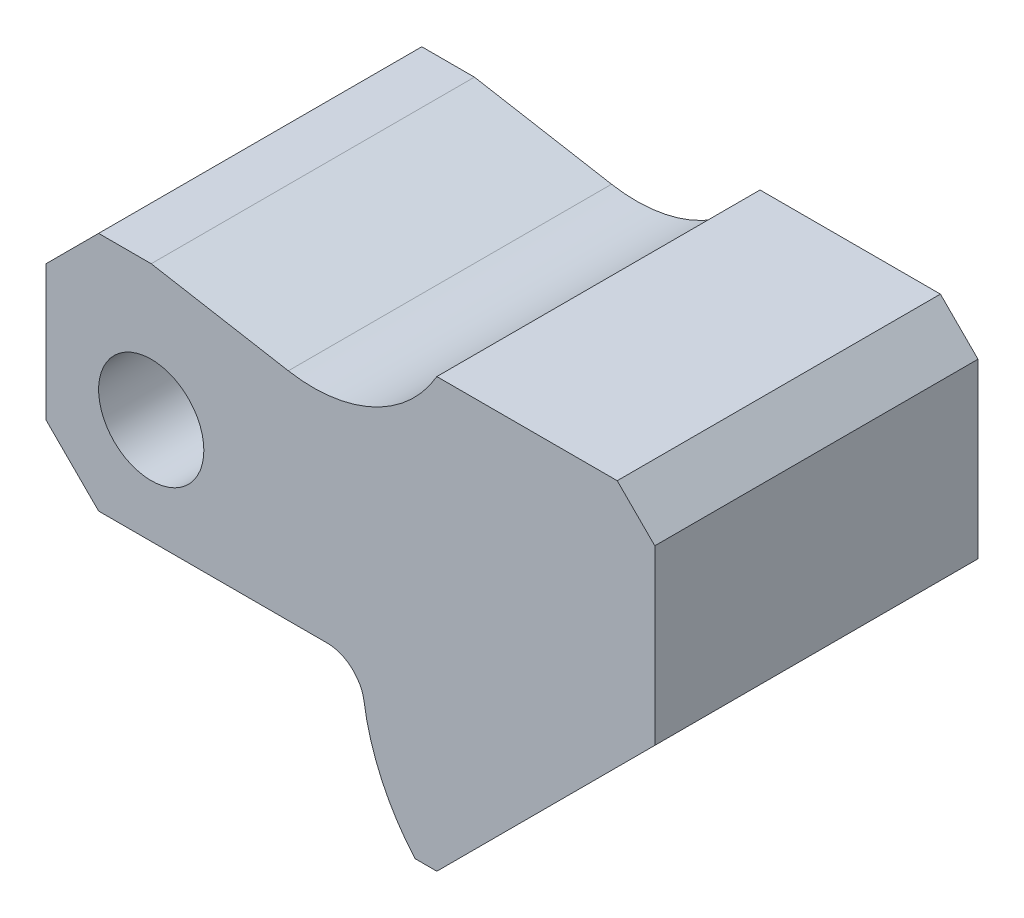
ISO-10303-21;
HEADER;
FILE_DESCRIPTION(('STEP AP214'),'2;1');
FILE_NAME('part.step','',(''),(''),'','','');
FILE_SCHEMA(('AUTOMOTIVE_DESIGN { 1 0 10303 214 1 1 1 1 }'));
ENDSEC;
DATA;
#1=APPLICATION_CONTEXT('core data for automotive mechanical design processes');
#2=APPLICATION_PROTOCOL_DEFINITION('international standard','automotive_design',2000,#1);
#3=PRODUCT_CONTEXT('',#1,'mechanical');
#4=PRODUCT('Part','Part','',(#3));
#5=PRODUCT_RELATED_PRODUCT_CATEGORY('part','',(#4));
#6=PRODUCT_DEFINITION_FORMATION('','',#4);
#7=PRODUCT_DEFINITION_CONTEXT('part definition',#1,'design');
#8=PRODUCT_DEFINITION('design','',#6,#7);
#9=PRODUCT_DEFINITION_SHAPE('','',#8);
#10=(LENGTH_UNIT() NAMED_UNIT(*) SI_UNIT(.MILLI.,.METRE.));
#11=(NAMED_UNIT(*) PLANE_ANGLE_UNIT() SI_UNIT($,.RADIAN.));
#12=(NAMED_UNIT(*) SI_UNIT($,.STERADIAN.) SOLID_ANGLE_UNIT());
#13=UNCERTAINTY_MEASURE_WITH_UNIT(LENGTH_MEASURE(1.E-05),#10,'distance_accuracy_value','');
#14=(GEOMETRIC_REPRESENTATION_CONTEXT(3) GLOBAL_UNCERTAINTY_ASSIGNED_CONTEXT((#13)) GLOBAL_UNIT_ASSIGNED_CONTEXT((#10,
#11,#12)) REPRESENTATION_CONTEXT('',''));
#15=CARTESIAN_POINT('',(0.,0.,0.));
#16=DIRECTION('',(0.,0.,1.));
#17=DIRECTION('',(1.,0.,0.));
#18=AXIS2_PLACEMENT_3D('',#15,#16,#17);
#19=CARTESIAN_POINT('',(37.3696565583993,-30.,43.));
#20=DIRECTION('',(0.,0.,-1.));
#21=DIRECTION('',(-1.,0.,0.));
#22=AXIS2_PLACEMENT_3D('',#19,#20,#21);
#23=PLANE('',#22);
#24=DIRECTION('',(0.,-1.,0.));
#25=VECTOR('',#24,1.);
#26=CARTESIAN_POINT('',(0.,0.,43.));
#27=LINE('',#26,#25);
#28=CARTESIAN_POINT('',(0.,0.,43.));
#29=VERTEX_POINT('',#28);
#30=CARTESIAN_POINT('',(0.,-18.,43.));
#31=VERTEX_POINT('',#30);
#32=EDGE_CURVE('E198',#29,#31,#27,.T.);
#33=ORIENTED_EDGE('',*,*,#32,.T.);
#34=DIRECTION('',(0.707106781186549,-0.707106781186546,0.));
#35=VECTOR('',#34,1.);
#36=CARTESIAN_POINT('',(0.,-18.,43.));
#37=LINE('',#36,#35);
#38=CARTESIAN_POINT('',(7.00000000000003,-25.,43.));
#39=VERTEX_POINT('',#38);
#40=EDGE_CURVE('E116',#31,#39,#37,.T.);
#41=ORIENTED_EDGE('',*,*,#40,.T.);
#42=DIRECTION('',(1.,0.,0.));
#43=VECTOR('',#42,1.);
#44=CARTESIAN_POINT('',(7.00000000000003,-25.,43.));
#45=LINE('',#44,#43);
#46=CARTESIAN_POINT('',(37.3696565583993,-25.,43.));
#47=VERTEX_POINT('',#46);
#48=EDGE_CURVE('E231',#39,#47,#45,.T.);
#49=ORIENTED_EDGE('',*,*,#48,.T.);
#50=CARTESIAN_POINT('',(37.3696565583993,-30.,43.));
#51=DIRECTION('',(0.,0.,-1.));
#52=DIRECTION('',(-1.,0.,0.));
#53=AXIS2_PLACEMENT_3D('',#50,#51,#52);
#54=CIRCLE('',#53,5.);
#55=CARTESIAN_POINT('',(42.3152952998111,-29.2647058823529,43.));
#56=VERTEX_POINT('',#55);
#57=EDGE_CURVE('E250',#47,#56,#54,.T.);
#58=ORIENTED_EDGE('',*,*,#57,.T.);
#59=CARTESIAN_POINT('',(70.9999999999997,-25.,43.));
#60=DIRECTION('',(0.,0.,1.));
#61=DIRECTION('',(1.,0.,0.));
#62=AXIS2_PLACEMENT_3D('',#59,#60,#61);
#63=CIRCLE('',#62,29.);
#64=CARTESIAN_POINT('',(49.0910976997931,-44.,43.));
#65=VERTEX_POINT('',#64);
#66=EDGE_CURVE('E247',#56,#65,#63,.T.);
#67=ORIENTED_EDGE('',*,*,#66,.T.);
#68=DIRECTION('',(1.,0.,0.));
#69=VECTOR('',#68,1.);
#70=CARTESIAN_POINT('',(52.,-44.,43.));
#71=LINE('',#70,#69);
#72=CARTESIAN_POINT('',(52.,-44.,43.));
#73=VERTEX_POINT('',#72);
#74=EDGE_CURVE('E249',#65,#73,#71,.T.);
#75=ORIENTED_EDGE('',*,*,#74,.T.);
#76=DIRECTION('',(0.707106781186542,0.707106781186552,0.));
#77=VECTOR('',#76,1.);
#78=CARTESIAN_POINT('',(81.,-14.9999999999996,43.));
#79=LINE('',#78,#77);
#80=CARTESIAN_POINT('',(81.,-14.9999999999996,43.));
#81=VERTEX_POINT('',#80);
#82=EDGE_CURVE('E252',#73,#81,#79,.T.);
#83=ORIENTED_EDGE('',*,*,#82,.T.);
#84=DIRECTION('',(0.,1.,0.));
#85=VECTOR('',#84,1.);
#86=CARTESIAN_POINT('',(81.,8.,43.));
#87=LINE('',#86,#85);
#88=CARTESIAN_POINT('',(81.,8.,43.));
#89=VERTEX_POINT('',#88);
#90=EDGE_CURVE('E258',#81,#89,#87,.T.);
#91=ORIENTED_EDGE('',*,*,#90,.T.);
#92=DIRECTION('',(-0.707106781186553,0.707106781186542,0.));
#93=VECTOR('',#92,1.);
#94=CARTESIAN_POINT('',(75.9999999999999,13.,43.));
#95=LINE('',#94,#93);
#96=CARTESIAN_POINT('',(75.9999999999999,13.,43.));
#97=VERTEX_POINT('',#96);
#98=EDGE_CURVE('E260',#89,#97,#95,.T.);
#99=ORIENTED_EDGE('',*,*,#98,.T.);
#100=DIRECTION('',(-1.,0.,0.));
#101=VECTOR('',#100,1.);
#102=CARTESIAN_POINT('',(52.,13.,43.));
#103=LINE('',#102,#101);
#104=CARTESIAN_POINT('',(52.,13.,43.));
#105=VERTEX_POINT('',#104);
#106=EDGE_CURVE('E262',#97,#105,#103,.T.);
#107=ORIENTED_EDGE('',*,*,#106,.T.);
#108=CARTESIAN_POINT('',(35.5424003635473,22.4945992125119,43.));
#109=DIRECTION('',(0.,0.,-1.));
#110=DIRECTION('',(1.,0.,0.));
#111=AXIS2_PLACEMENT_3D('',#108,#109,#110);
#112=CIRCLE('',#111,19.);
#113=CARTESIAN_POINT('',(32.2430849878756,3.78325190527996,43.));
#114=VERTEX_POINT('',#113);
#115=EDGE_CURVE('E153',#105,#114,#112,.T.);
#116=ORIENTED_EDGE('',*,*,#115,.T.);
#117=DIRECTION('',(-0.984807753012208,0.173648177666931,0.));
#118=VECTOR('',#117,1.);
#119=CARTESIAN_POINT('',(14.,7.,43.));
#120=LINE('',#119,#118);
#121=CARTESIAN_POINT('',(14.,7.,43.));
#122=VERTEX_POINT('',#121);
#123=EDGE_CURVE('E147',#114,#122,#120,.T.);
#124=ORIENTED_EDGE('',*,*,#123,.T.);
#125=DIRECTION('',(-1.,0.,0.));
#126=VECTOR('',#125,1.);
#127=CARTESIAN_POINT('',(6.9999999999999,7.,43.));
#128=LINE('',#127,#126);
#129=CARTESIAN_POINT('',(6.9999999999999,7.,43.));
#130=VERTEX_POINT('',#129);
#131=EDGE_CURVE('E151',#122,#130,#128,.T.);
#132=ORIENTED_EDGE('',*,*,#131,.T.);
#133=DIRECTION('',(-0.707106781186542,-0.707106781186552,0.));
#134=VECTOR('',#133,1.);
#135=CARTESIAN_POINT('',(0.,0.,43.));
#136=LINE('',#135,#134);
#137=EDGE_CURVE('E55',#130,#29,#136,.T.);
#138=ORIENTED_EDGE('',*,*,#137,.T.);
#139=EDGE_LOOP('',(#33,#41,#49,#58,#67,#75,#83,#91,#99,#107,#116,#124,#132,#138));
#140=FACE_BOUND('',#139,.T.);
#141=CARTESIAN_POINT('',(14.,-11.,43.));
#142=DIRECTION('',(0.,0.,1.));
#143=DIRECTION('',(1.,0.,0.));
#144=AXIS2_PLACEMENT_3D('',#141,#142,#143);
#145=CIRCLE('',#144,7.);
#146=CARTESIAN_POINT('',(21.,-11.,43.));
#147=VERTEX_POINT('',#146);
#148=EDGE_CURVE('E175',#147,#147,#145,.T.);
#149=ORIENTED_EDGE('',*,*,#148,.F.);
#150=EDGE_LOOP('',(#149));
#151=FACE_BOUND('',#150,.T.);
#152=ADVANCED_FACE('F38',(#140,#151),#23,.F.);
#153=CARTESIAN_POINT('',(37.3696565583993,-30.,0.));
#154=DIRECTION('',(0.,0.,-1.));
#155=DIRECTION('',(-1.,0.,0.));
#156=AXIS2_PLACEMENT_3D('',#153,#154,#155);
#157=PLANE('',#156);
#158=DIRECTION('',(0.,-1.,0.));
#159=VECTOR('',#158,1.);
#160=CARTESIAN_POINT('',(0.,0.,0.));
#161=LINE('',#160,#159);
#162=CARTESIAN_POINT('',(0.,0.,0.));
#163=VERTEX_POINT('',#162);
#164=CARTESIAN_POINT('',(0.,-18.,0.));
#165=VERTEX_POINT('',#164);
#166=EDGE_CURVE('E171',#163,#165,#161,.T.);
#167=ORIENTED_EDGE('',*,*,#166,.F.);
#168=DIRECTION('',(-0.707106781186542,-0.707106781186552,0.));
#169=VECTOR('',#168,1.);
#170=CARTESIAN_POINT('',(0.,0.,0.));
#171=LINE('',#170,#169);
#172=CARTESIAN_POINT('',(6.9999999999999,7.,0.));
#173=VERTEX_POINT('',#172);
#174=EDGE_CURVE('E108',#173,#163,#171,.T.);
#175=ORIENTED_EDGE('',*,*,#174,.F.);
#176=DIRECTION('',(-1.,0.,0.));
#177=VECTOR('',#176,1.);
#178=CARTESIAN_POINT('',(6.9999999999999,7.,0.));
#179=LINE('',#178,#177);
#180=CARTESIAN_POINT('',(14.,7.,0.));
#181=VERTEX_POINT('',#180);
#182=EDGE_CURVE('E102',#181,#173,#179,.T.);
#183=ORIENTED_EDGE('',*,*,#182,.F.);
#184=DIRECTION('',(-0.984807753012208,0.173648177666931,0.));
#185=VECTOR('',#184,1.);
#186=CARTESIAN_POINT('',(14.,7.,0.));
#187=LINE('',#186,#185);
#188=CARTESIAN_POINT('',(32.2430849878756,3.78325190527996,0.));
#189=VERTEX_POINT('',#188);
#190=EDGE_CURVE('E161',#189,#181,#187,.T.);
#191=ORIENTED_EDGE('',*,*,#190,.F.);
#192=CARTESIAN_POINT('',(35.5424003635473,22.4945992125119,0.));
#193=DIRECTION('',(0.,0.,-1.));
#194=DIRECTION('',(1.,0.,0.));
#195=AXIS2_PLACEMENT_3D('',#192,#193,#194);
#196=CIRCLE('',#195,19.);
#197=CARTESIAN_POINT('',(52.,13.,0.));
#198=VERTEX_POINT('',#197);
#199=EDGE_CURVE('E193',#198,#189,#196,.T.);
#200=ORIENTED_EDGE('',*,*,#199,.F.);
#201=DIRECTION('',(-1.,0.,0.));
#202=VECTOR('',#201,1.);
#203=CARTESIAN_POINT('',(52.,13.,0.));
#204=LINE('',#203,#202);
#205=CARTESIAN_POINT('',(75.9999999999999,13.,0.));
#206=VERTEX_POINT('',#205);
#207=EDGE_CURVE('E191',#206,#198,#204,.T.);
#208=ORIENTED_EDGE('',*,*,#207,.F.);
#209=DIRECTION('',(-0.707106781186553,0.707106781186542,0.));
#210=VECTOR('',#209,1.);
#211=CARTESIAN_POINT('',(75.9999999999999,13.,0.));
#212=LINE('',#211,#210);
#213=CARTESIAN_POINT('',(81.,8.,0.));
#214=VERTEX_POINT('',#213);
#215=EDGE_CURVE('E189',#214,#206,#212,.T.);
#216=ORIENTED_EDGE('',*,*,#215,.F.);
#217=DIRECTION('',(0.,1.,0.));
#218=VECTOR('',#217,1.);
#219=CARTESIAN_POINT('',(81.,8.,0.));
#220=LINE('',#219,#218);
#221=CARTESIAN_POINT('',(81.,-14.9999999999996,0.));
#222=VERTEX_POINT('',#221);
#223=EDGE_CURVE('E187',#222,#214,#220,.T.);
#224=ORIENTED_EDGE('',*,*,#223,.F.);
#225=DIRECTION('',(0.707106781186542,0.707106781186552,0.));
#226=VECTOR('',#225,1.);
#227=CARTESIAN_POINT('',(81.,-14.9999999999996,0.));
#228=LINE('',#227,#226);
#229=CARTESIAN_POINT('',(52.,-44.,0.));
#230=VERTEX_POINT('',#229);
#231=EDGE_CURVE('E185',#230,#222,#228,.T.);
#232=ORIENTED_EDGE('',*,*,#231,.F.);
#233=DIRECTION('',(1.,0.,0.));
#234=VECTOR('',#233,1.);
#235=CARTESIAN_POINT('',(52.,-44.,0.));
#236=LINE('',#235,#234);
#237=CARTESIAN_POINT('',(49.0910976997931,-44.,0.));
#238=VERTEX_POINT('',#237);
#239=EDGE_CURVE('E183',#238,#230,#236,.T.);
#240=ORIENTED_EDGE('',*,*,#239,.F.);
#241=CARTESIAN_POINT('',(70.9999999999997,-25.,0.));
#242=DIRECTION('',(0.,0.,1.));
#243=DIRECTION('',(1.,0.,0.));
#244=AXIS2_PLACEMENT_3D('',#241,#242,#243);
#245=CIRCLE('',#244,29.);
#246=CARTESIAN_POINT('',(42.3152952998111,-29.2647058823529,0.));
#247=VERTEX_POINT('',#246);
#248=EDGE_CURVE('E181',#247,#238,#245,.T.);
#249=ORIENTED_EDGE('',*,*,#248,.F.);
#250=CARTESIAN_POINT('',(37.3696565583993,-30.,0.));
#251=DIRECTION('',(0.,0.,-1.));
#252=DIRECTION('',(-1.,0.,0.));
#253=AXIS2_PLACEMENT_3D('',#250,#251,#252);
#254=CIRCLE('',#253,5.);
#255=CARTESIAN_POINT('',(37.3696565583993,-25.,0.));
#256=VERTEX_POINT('',#255);
#257=EDGE_CURVE('E179',#256,#247,#254,.T.);
#258=ORIENTED_EDGE('',*,*,#257,.F.);
#259=DIRECTION('',(1.,0.,0.));
#260=VECTOR('',#259,1.);
#261=CARTESIAN_POINT('',(7.00000000000003,-25.,0.));
#262=LINE('',#261,#260);
#263=CARTESIAN_POINT('',(7.00000000000003,-25.,0.));
#264=VERTEX_POINT('',#263);
#265=EDGE_CURVE('E177',#264,#256,#262,.T.);
#266=ORIENTED_EDGE('',*,*,#265,.F.);
#267=DIRECTION('',(0.707106781186549,-0.707106781186546,0.));
#268=VECTOR('',#267,1.);
#269=CARTESIAN_POINT('',(0.,-18.,0.));
#270=LINE('',#269,#268);
#271=EDGE_CURVE('E174',#165,#264,#270,.T.);
#272=ORIENTED_EDGE('',*,*,#271,.F.);
#273=EDGE_LOOP('',(#167,#175,#183,#191,#200,#208,#216,#224,#232,#240,#249,#258,#266,#272));
#274=FACE_BOUND('',#273,.T.);
#275=CARTESIAN_POINT('',(14.,-11.,0.));
#276=DIRECTION('',(0.,0.,1.));
#277=DIRECTION('',(1.,0.,0.));
#278=AXIS2_PLACEMENT_3D('',#275,#276,#277);
#279=CIRCLE('',#278,7.);
#280=CARTESIAN_POINT('',(21.,-11.,0.));
#281=VERTEX_POINT('',#280);
#282=EDGE_CURVE('E503',#281,#281,#279,.T.);
#283=ORIENTED_EDGE('',*,*,#282,.T.);
#284=EDGE_LOOP('',(#283));
#285=FACE_BOUND('',#284,.T.);
#286=ADVANCED_FACE('F235',(#274,#285),#157,.T.);
#287=CARTESIAN_POINT('',(0.,0.,43.));
#288=DIRECTION('',(1.,0.,0.));
#289=DIRECTION('',(0.,1.,0.));
#290=AXIS2_PLACEMENT_3D('',#287,#288,#289);
#291=PLANE('',#290);
#292=ORIENTED_EDGE('',*,*,#166,.T.);
#293=DIRECTION('',(0.,0.,-1.));
#294=VECTOR('',#293,1.);
#295=CARTESIAN_POINT('',(0.,-18.,43.));
#296=LINE('',#295,#294);
#297=EDGE_CURVE('E11',#31,#165,#296,.T.);
#298=ORIENTED_EDGE('',*,*,#297,.F.);
#299=ORIENTED_EDGE('',*,*,#32,.F.);
#300=DIRECTION('',(0.,0.,-1.));
#301=VECTOR('',#300,1.);
#302=CARTESIAN_POINT('',(0.,0.,43.));
#303=LINE('',#302,#301);
#304=EDGE_CURVE('E167',#29,#163,#303,.T.);
#305=ORIENTED_EDGE('',*,*,#304,.T.);
#306=EDGE_LOOP('',(#292,#298,#299,#305));
#307=FACE_BOUND('',#306,.T.);
#308=ADVANCED_FACE('F40',(#307),#291,.F.);
#309=CARTESIAN_POINT('',(0.,-18.,43.));
#310=DIRECTION('',(0.707106781186546,0.707106781186549,0.));
#311=DIRECTION('',(-0.707106781186549,0.707106781186546,0.));
#312=AXIS2_PLACEMENT_3D('',#309,#310,#311);
#313=PLANE('',#312);
#314=ORIENTED_EDGE('',*,*,#271,.T.);
#315=DIRECTION('',(0.,0.,-1.));
#316=VECTOR('',#315,1.);
#317=CARTESIAN_POINT('',(7.00000000000003,-25.,43.));
#318=LINE('',#317,#316);
#319=EDGE_CURVE('E47',#39,#264,#318,.T.);
#320=ORIENTED_EDGE('',*,*,#319,.F.);
#321=ORIENTED_EDGE('',*,*,#40,.F.);
#322=ORIENTED_EDGE('',*,*,#297,.T.);
#323=EDGE_LOOP('',(#314,#320,#321,#322));
#324=FACE_BOUND('',#323,.T.);
#325=ADVANCED_FACE('F296',(#324),#313,.F.);
#326=CARTESIAN_POINT('',(7.00000000000003,-25.,43.));
#327=DIRECTION('',(0.,1.,0.));
#328=DIRECTION('',(0.,0.,1.));
#329=AXIS2_PLACEMENT_3D('',#326,#327,#328);
#330=PLANE('',#329);
#331=ORIENTED_EDGE('',*,*,#265,.T.);
#332=DIRECTION('',(0.,0.,-1.));
#333=VECTOR('',#332,1.);
#334=CARTESIAN_POINT('',(37.3696565583993,-25.,43.));
#335=LINE('',#334,#333);
#336=EDGE_CURVE('E223',#47,#256,#335,.T.);
#337=ORIENTED_EDGE('',*,*,#336,.F.);
#338=ORIENTED_EDGE('',*,*,#48,.F.);
#339=ORIENTED_EDGE('',*,*,#319,.T.);
#340=EDGE_LOOP('',(#331,#337,#338,#339));
#341=FACE_BOUND('',#340,.T.);
#342=ADVANCED_FACE('F229',(#341),#330,.F.);
#343=CARTESIAN_POINT('',(37.3696565583993,-30.,43.));
#344=DIRECTION('',(0.,0.,-1.));
#345=DIRECTION('',(-1.,0.,0.));
#346=AXIS2_PLACEMENT_3D('',#343,#344,#345);
#347=CYLINDRICAL_SURFACE('',#346,5.);
#348=ORIENTED_EDGE('',*,*,#257,.T.);
#349=DIRECTION('',(0.,0.,-1.));
#350=VECTOR('',#349,1.);
#351=CARTESIAN_POINT('',(42.3152952998111,-29.2647058823529,43.));
#352=LINE('',#351,#350);
#353=EDGE_CURVE('E220',#56,#247,#352,.T.);
#354=ORIENTED_EDGE('',*,*,#353,.F.);
#355=ORIENTED_EDGE('',*,*,#57,.F.);
#356=ORIENTED_EDGE('',*,*,#336,.T.);
#357=EDGE_LOOP('',(#348,#354,#355,#356));
#358=FACE_BOUND('',#357,.T.);
#359=ADVANCED_FACE('F241',(#358),#347,.F.);
#360=CARTESIAN_POINT('',(70.9999999999997,-25.,43.));
#361=DIRECTION('',(0.,0.,-1.));
#362=DIRECTION('',(-1.,0.,0.));
#363=AXIS2_PLACEMENT_3D('',#360,#361,#362);
#364=CYLINDRICAL_SURFACE('',#363,29.);
#365=ORIENTED_EDGE('',*,*,#248,.T.);
#366=DIRECTION('',(0.,0.,-1.));
#367=VECTOR('',#366,1.);
#368=CARTESIAN_POINT('',(49.0910976997931,-44.,43.));
#369=LINE('',#368,#367);
#370=EDGE_CURVE('E217',#65,#238,#369,.T.);
#371=ORIENTED_EDGE('',*,*,#370,.F.);
#372=ORIENTED_EDGE('',*,*,#66,.F.);
#373=ORIENTED_EDGE('',*,*,#353,.T.);
#374=EDGE_LOOP('',(#365,#371,#372,#373));
#375=FACE_BOUND('',#374,.T.);
#376=ADVANCED_FACE('F245',(#375),#364,.T.);
#377=CARTESIAN_POINT('',(52.,-44.,43.));
#378=DIRECTION('',(0.,1.,0.));
#379=DIRECTION('',(0.,0.,1.));
#380=AXIS2_PLACEMENT_3D('',#377,#378,#379);
#381=PLANE('',#380);
#382=ORIENTED_EDGE('',*,*,#239,.T.);
#383=DIRECTION('',(0.,0.,-1.));
#384=VECTOR('',#383,1.);
#385=CARTESIAN_POINT('',(52.,-44.,43.));
#386=LINE('',#385,#384);
#387=EDGE_CURVE('E214',#73,#230,#386,.T.);
#388=ORIENTED_EDGE('',*,*,#387,.F.);
#389=ORIENTED_EDGE('',*,*,#74,.F.);
#390=ORIENTED_EDGE('',*,*,#370,.T.);
#391=EDGE_LOOP('',(#382,#388,#389,#390));
#392=FACE_BOUND('',#391,.T.);
#393=ADVANCED_FACE('F309',(#392),#381,.F.);
#394=CARTESIAN_POINT('',(81.,-14.9999999999996,43.));
#395=DIRECTION('',(-0.707106781186552,0.707106781186542,0.));
#396=DIRECTION('',(-0.707106781186543,-0.707106781186553,0.));
#397=AXIS2_PLACEMENT_3D('',#394,#395,#396);
#398=PLANE('',#397);
#399=ORIENTED_EDGE('',*,*,#231,.T.);
#400=DIRECTION('',(0.,0.,-1.));
#401=VECTOR('',#400,1.);
#402=CARTESIAN_POINT('',(81.,-14.9999999999996,43.));
#403=LINE('',#402,#401);
#404=EDGE_CURVE('E211',#81,#222,#403,.T.);
#405=ORIENTED_EDGE('',*,*,#404,.F.);
#406=ORIENTED_EDGE('',*,*,#82,.F.);
#407=ORIENTED_EDGE('',*,*,#387,.T.);
#408=EDGE_LOOP('',(#399,#405,#406,#407));
#409=FACE_BOUND('',#408,.T.);
#410=ADVANCED_FACE('F312',(#409),#398,.F.);
#411=CARTESIAN_POINT('',(81.,8.,43.));
#412=DIRECTION('',(-1.,0.,0.));
#413=DIRECTION('',(0.,0.,1.));
#414=AXIS2_PLACEMENT_3D('',#411,#412,#413);
#415=PLANE('',#414);
#416=ORIENTED_EDGE('',*,*,#223,.T.);
#417=DIRECTION('',(0.,0.,-1.));
#418=VECTOR('',#417,1.);
#419=CARTESIAN_POINT('',(81.,8.,43.));
#420=LINE('',#419,#418);
#421=EDGE_CURVE('E208',#89,#214,#420,.T.);
#422=ORIENTED_EDGE('',*,*,#421,.F.);
#423=ORIENTED_EDGE('',*,*,#90,.F.);
#424=ORIENTED_EDGE('',*,*,#404,.T.);
#425=EDGE_LOOP('',(#416,#422,#423,#424));
#426=FACE_BOUND('',#425,.T.);
#427=ADVANCED_FACE('F316',(#426),#415,.F.);
#428=CARTESIAN_POINT('',(75.9999999999999,13.,43.));
#429=DIRECTION('',(-0.707106781186542,-0.707106781186553,0.));
#430=DIRECTION('',(0.707106781186553,-0.707106781186542,0.));
#431=AXIS2_PLACEMENT_3D('',#428,#429,#430);
#432=PLANE('',#431);
#433=ORIENTED_EDGE('',*,*,#215,.T.);
#434=DIRECTION('',(0.,0.,-1.));
#435=VECTOR('',#434,1.);
#436=CARTESIAN_POINT('',(75.9999999999999,13.,43.));
#437=LINE('',#436,#435);
#438=EDGE_CURVE('E205',#97,#206,#437,.T.);
#439=ORIENTED_EDGE('',*,*,#438,.F.);
#440=ORIENTED_EDGE('',*,*,#98,.F.);
#441=ORIENTED_EDGE('',*,*,#421,.T.);
#442=EDGE_LOOP('',(#433,#439,#440,#441));
#443=FACE_BOUND('',#442,.T.);
#444=ADVANCED_FACE('F320',(#443),#432,.F.);
#445=CARTESIAN_POINT('',(52.,13.,43.));
#446=DIRECTION('',(0.,-1.,0.));
#447=DIRECTION('',(0.,0.,-1.));
#448=AXIS2_PLACEMENT_3D('',#445,#446,#447);
#449=PLANE('',#448);
#450=ORIENTED_EDGE('',*,*,#207,.T.);
#451=DIRECTION('',(0.,0.,-1.));
#452=VECTOR('',#451,1.);
#453=CARTESIAN_POINT('',(52.,13.,43.));
#454=LINE('',#453,#452);
#455=EDGE_CURVE('E202',#105,#198,#454,.T.);
#456=ORIENTED_EDGE('',*,*,#455,.F.);
#457=ORIENTED_EDGE('',*,*,#106,.F.);
#458=ORIENTED_EDGE('',*,*,#438,.T.);
#459=EDGE_LOOP('',(#450,#456,#457,#458));
#460=FACE_BOUND('',#459,.T.);
#461=ADVANCED_FACE('F268',(#460),#449,.F.);
#462=CARTESIAN_POINT('',(35.5424003635473,22.4945992125119,43.));
#463=DIRECTION('',(0.,0.,-1.));
#464=DIRECTION('',(-1.,0.,0.));
#465=AXIS2_PLACEMENT_3D('',#462,#463,#464);
#466=CYLINDRICAL_SURFACE('',#465,19.);
#467=ORIENTED_EDGE('',*,*,#199,.T.);
#468=DIRECTION('',(0.,0.,-1.));
#469=VECTOR('',#468,1.);
#470=CARTESIAN_POINT('',(32.2430849878756,3.78325190527996,43.));
#471=LINE('',#470,#469);
#472=EDGE_CURVE('E162',#114,#189,#471,.T.);
#473=ORIENTED_EDGE('',*,*,#472,.F.);
#474=ORIENTED_EDGE('',*,*,#115,.F.);
#475=ORIENTED_EDGE('',*,*,#455,.T.);
#476=EDGE_LOOP('',(#467,#473,#474,#475));
#477=FACE_BOUND('',#476,.T.);
#478=ADVANCED_FACE('F272',(#477),#466,.F.);
#479=CARTESIAN_POINT('',(14.,7.,43.));
#480=DIRECTION('',(-0.173648177666931,-0.984807753012208,0.));
#481=DIRECTION('',(0.984807753012208,-0.173648177666931,0.));
#482=AXIS2_PLACEMENT_3D('',#479,#480,#481);
#483=PLANE('',#482);
#484=ORIENTED_EDGE('',*,*,#190,.T.);
#485=DIRECTION('',(0.,0.,-1.));
#486=VECTOR('',#485,1.);
#487=CARTESIAN_POINT('',(14.,7.,43.));
#488=LINE('',#487,#486);
#489=EDGE_CURVE('E158',#122,#181,#488,.T.);
#490=ORIENTED_EDGE('',*,*,#489,.F.);
#491=ORIENTED_EDGE('',*,*,#123,.F.);
#492=ORIENTED_EDGE('',*,*,#472,.T.);
#493=EDGE_LOOP('',(#484,#490,#491,#492));
#494=FACE_BOUND('',#493,.T.);
#495=ADVANCED_FACE('F159',(#494),#483,.F.);
#496=CARTESIAN_POINT('',(6.9999999999999,7.,43.));
#497=DIRECTION('',(0.,-1.,0.));
#498=DIRECTION('',(1.,0.,0.));
#499=AXIS2_PLACEMENT_3D('',#496,#497,#498);
#500=PLANE('',#499);
#501=ORIENTED_EDGE('',*,*,#182,.T.);
#502=DIRECTION('',(0.,0.,-1.));
#503=VECTOR('',#502,1.);
#504=CARTESIAN_POINT('',(6.9999999999999,7.,43.));
#505=LINE('',#504,#503);
#506=EDGE_CURVE('E163',#130,#173,#505,.T.);
#507=ORIENTED_EDGE('',*,*,#506,.F.);
#508=ORIENTED_EDGE('',*,*,#131,.F.);
#509=ORIENTED_EDGE('',*,*,#489,.T.);
#510=EDGE_LOOP('',(#501,#507,#508,#509));
#511=FACE_BOUND('',#510,.T.);
#512=ADVANCED_FACE('F165',(#511),#500,.F.);
#513=CARTESIAN_POINT('',(0.,0.,43.));
#514=DIRECTION('',(0.707106781186552,-0.707106781186542,0.));
#515=DIRECTION('',(0.707106781186543,0.707106781186553,0.));
#516=AXIS2_PLACEMENT_3D('',#513,#514,#515);
#517=PLANE('',#516);
#518=ORIENTED_EDGE('',*,*,#174,.T.);
#519=ORIENTED_EDGE('',*,*,#304,.F.);
#520=ORIENTED_EDGE('',*,*,#137,.F.);
#521=ORIENTED_EDGE('',*,*,#506,.T.);
#522=EDGE_LOOP('',(#518,#519,#520,#521));
#523=FACE_BOUND('',#522,.T.);
#524=ADVANCED_FACE('F276',(#523),#517,.F.);
#525=CARTESIAN_POINT('',(14.,-11.,43.));
#526=DIRECTION('',(0.,0.,-1.));
#527=DIRECTION('',(-1.,0.,0.));
#528=AXIS2_PLACEMENT_3D('',#525,#526,#527);
#529=CYLINDRICAL_SURFACE('',#528,7.);
#530=ORIENTED_EDGE('',*,*,#148,.T.);
#531=EDGE_LOOP('',(#530));
#532=FACE_BOUND('',#531,.T.);
#533=ORIENTED_EDGE('',*,*,#282,.F.);
#534=EDGE_LOOP('',(#533));
#535=FACE_BOUND('',#534,.T.);
#536=ADVANCED_FACE('F278',(#532,#535),#529,.F.);
#537=CLOSED_SHELL('',(#152,#286,#308,#325,#342,#359,#376,#393,#410,#427,#444,#461,#478,#495,
#512,#524,#536));
#538=MANIFOLD_SOLID_BREP('B2',#537);
#539=ADVANCED_BREP_SHAPE_REPRESENTATION('',(#18,#538),#14);
#540=SHAPE_DEFINITION_REPRESENTATION(#9,#539);
ENDSEC;
END-ISO-10303-21;
